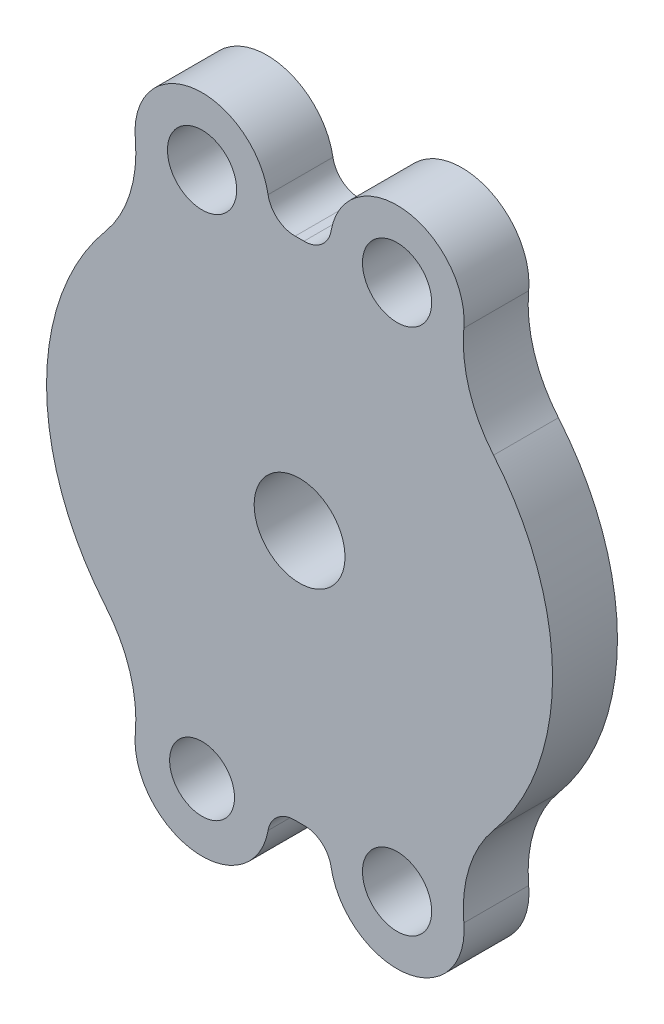
ISO-10303-21;
HEADER;
FILE_DESCRIPTION(('STEP AP214'),'2;1');
FILE_NAME('part.step','',(''),(''),'','','');
FILE_SCHEMA(('AUTOMOTIVE_DESIGN { 1 0 10303 214 1 1 1 1 }'));
ENDSEC;
DATA;
#1=APPLICATION_CONTEXT('core data for automotive mechanical design processes');
#2=APPLICATION_PROTOCOL_DEFINITION('international standard','automotive_design',2000,#1);
#3=PRODUCT_CONTEXT('',#1,'mechanical');
#4=PRODUCT('Part','Part','',(#3));
#5=PRODUCT_RELATED_PRODUCT_CATEGORY('part','',(#4));
#6=PRODUCT_DEFINITION_FORMATION('','',#4);
#7=PRODUCT_DEFINITION_CONTEXT('part definition',#1,'design');
#8=PRODUCT_DEFINITION('design','',#6,#7);
#9=PRODUCT_DEFINITION_SHAPE('','',#8);
#10=(LENGTH_UNIT() NAMED_UNIT(*) SI_UNIT(.MILLI.,.METRE.));
#11=(NAMED_UNIT(*) PLANE_ANGLE_UNIT() SI_UNIT($,.RADIAN.));
#12=(NAMED_UNIT(*) SI_UNIT($,.STERADIAN.) SOLID_ANGLE_UNIT());
#13=UNCERTAINTY_MEASURE_WITH_UNIT(LENGTH_MEASURE(1.E-05),#10,'distance_accuracy_value','');
#14=(GEOMETRIC_REPRESENTATION_CONTEXT(3) GLOBAL_UNCERTAINTY_ASSIGNED_CONTEXT((#13)) GLOBAL_UNIT_ASSIGNED_CONTEXT((#10,
#11,#12)) REPRESENTATION_CONTEXT('',''));
#15=CARTESIAN_POINT('',(0.,0.,0.));
#16=DIRECTION('',(0.,0.,1.));
#17=DIRECTION('',(1.,0.,0.));
#18=AXIS2_PLACEMENT_3D('',#15,#16,#17);
#19=CARTESIAN_POINT('',(-4.50880281690145,-12.1930593846788,-3.));
#20=DIRECTION('',(0.,0.,1.));
#21=DIRECTION('',(1.,0.,0.));
#22=AXIS2_PLACEMENT_3D('',#19,#20,#21);
#23=CYLINDRICAL_SURFACE('',#22,1.5);
#24=CARTESIAN_POINT('',(-4.50880281690145,-12.1930593846788,0.));
#25=DIRECTION('',(0.,0.,1.));
#26=DIRECTION('',(1.,0.,0.));
#27=AXIS2_PLACEMENT_3D('',#24,#25,#26);
#28=CIRCLE('',#27,1.5);
#29=CARTESIAN_POINT('',(-3.00880281690145,-12.1930593846788,0.));
#30=VERTEX_POINT('',#29);
#31=EDGE_CURVE('E395',#30,#30,#28,.T.);
#32=ORIENTED_EDGE('',*,*,#31,.T.);
#33=EDGE_LOOP('',(#32));
#34=FACE_BOUND('',#33,.T.);
#35=CARTESIAN_POINT('',(-4.50880281690145,-12.1930593846788,-3.));
#36=DIRECTION('',(0.,0.,1.));
#37=DIRECTION('',(1.,0.,0.));
#38=AXIS2_PLACEMENT_3D('',#35,#36,#37);
#39=CIRCLE('',#38,1.5);
#40=CARTESIAN_POINT('',(-3.00880281690145,-12.1930593846788,-3.));
#41=VERTEX_POINT('',#40);
#42=EDGE_CURVE('E240',#41,#41,#39,.T.);
#43=ORIENTED_EDGE('',*,*,#42,.F.);
#44=EDGE_LOOP('',(#43));
#45=FACE_BOUND('',#44,.T.);
#46=ADVANCED_FACE('F101',(#34,#45),#23,.F.);
#47=CARTESIAN_POINT('',(-4.50880281690145,-12.1930593846788,-3.));
#48=DIRECTION('',(0.,0.,1.));
#49=DIRECTION('',(1.,0.,0.));
#50=AXIS2_PLACEMENT_3D('',#47,#48,#49);
#51=CYLINDRICAL_SURFACE('',#50,3.1);
#52=CARTESIAN_POINT('',(-4.50880281690145,-12.1930593846788,-3.));
#53=DIRECTION('',(0.,0.,1.));
#54=DIRECTION('',(1.,0.,0.));
#55=AXIS2_PLACEMENT_3D('',#52,#53,#54);
#56=CIRCLE('',#55,3.1);
#57=CARTESIAN_POINT('',(-7.59588423001124,-11.9103433631447,-3.));
#58=VERTEX_POINT('',#57);
#59=CARTESIAN_POINT('',(-1.45585096363241,-12.7310974703392,-3.));
#60=VERTEX_POINT('',#59);
#61=EDGE_CURVE('E245',#58,#60,#56,.T.);
#62=ORIENTED_EDGE('',*,*,#61,.T.);
#63=DIRECTION('',(0.,0.,1.));
#64=VECTOR('',#63,1.);
#65=CARTESIAN_POINT('',(-1.45585096363241,-12.7310974703392,-3.));
#66=LINE('',#65,#64);
#67=CARTESIAN_POINT('',(-1.45585096363241,-12.7310974703392,0.));
#68=VERTEX_POINT('',#67);
#69=EDGE_CURVE('E362',#60,#68,#66,.T.);
#70=ORIENTED_EDGE('',*,*,#69,.T.);
#71=CARTESIAN_POINT('',(-4.50880281690145,-12.1930593846788,0.));
#72=DIRECTION('',(0.,0.,1.));
#73=DIRECTION('',(1.,0.,0.));
#74=AXIS2_PLACEMENT_3D('',#71,#72,#73);
#75=CIRCLE('',#74,3.1);
#76=CARTESIAN_POINT('',(-7.59588423001124,-11.9103433631447,0.));
#77=VERTEX_POINT('',#76);
#78=EDGE_CURVE('E392',#77,#68,#75,.T.);
#79=ORIENTED_EDGE('',*,*,#78,.F.);
#80=DIRECTION('',(0.,0.,1.));
#81=VECTOR('',#80,1.);
#82=CARTESIAN_POINT('',(-7.59588423001124,-11.9103433631447,-3.));
#83=LINE('',#82,#81);
#84=EDGE_CURVE('E255',#77,#58,#83,.F.);
#85=ORIENTED_EDGE('',*,*,#84,.T.);
#86=EDGE_LOOP('',(#62,#70,#79,#85));
#87=FACE_BOUND('',#86,.T.);
#88=ADVANCED_FACE('F391',(#87),#51,.T.);
#89=CARTESIAN_POINT('',(0.,0.,0.));
#90=DIRECTION('',(0.,0.,1.));
#91=DIRECTION('',(1.,0.,0.));
#92=AXIS2_PLACEMENT_3D('',#89,#90,#91);
#93=PLANE('',#92);
#94=CARTESIAN_POINT('',(0.,0.,0.));
#95=DIRECTION('',(0.,0.,1.));
#96=DIRECTION('',(1.,0.,0.));
#97=AXIS2_PLACEMENT_3D('',#94,#95,#96);
#98=CIRCLE('',#97,2.1);
#99=CARTESIAN_POINT('',(-2.1,0.,0.));
#100=VERTEX_POINT('',#99);
#101=EDGE_CURVE('E413',#100,#100,#98,.F.);
#102=ORIENTED_EDGE('',*,*,#101,.T.);
#103=EDGE_LOOP('',(#102));
#104=FACE_BOUND('',#103,.T.);
#105=ORIENTED_EDGE('',*,*,#31,.F.);
#106=EDGE_LOOP('',(#105));
#107=FACE_BOUND('',#106,.T.);
#108=CARTESIAN_POINT('',(4.50880281690123,-12.1930593846788,0.));
#109=DIRECTION('',(0.,0.,1.));
#110=DIRECTION('',(1.,0.,0.));
#111=AXIS2_PLACEMENT_3D('',#108,#109,#110);
#112=CIRCLE('',#111,1.6);
#113=CARTESIAN_POINT('',(6.10880281690124,-12.1930593846788,0.));
#114=VERTEX_POINT('',#113);
#115=EDGE_CURVE('E451',#114,#114,#112,.T.);
#116=ORIENTED_EDGE('',*,*,#115,.F.);
#117=EDGE_LOOP('',(#116));
#118=FACE_BOUND('',#117,.T.);
#119=CARTESIAN_POINT('',(4.50880281690123,12.1930593846787,0.));
#120=DIRECTION('',(0.,0.,1.));
#121=DIRECTION('',(1.,0.,0.));
#122=AXIS2_PLACEMENT_3D('',#119,#120,#121);
#123=CIRCLE('',#122,1.6);
#124=CARTESIAN_POINT('',(6.10880281690124,12.1930593846787,0.));
#125=VERTEX_POINT('',#124);
#126=EDGE_CURVE('E327',#125,#125,#123,.T.);
#127=ORIENTED_EDGE('',*,*,#126,.F.);
#128=EDGE_LOOP('',(#127));
#129=FACE_BOUND('',#128,.T.);
#130=CARTESIAN_POINT('',(-4.50880281690145,12.1930593846787,0.));
#131=DIRECTION('',(0.,0.,1.));
#132=DIRECTION('',(1.,0.,0.));
#133=AXIS2_PLACEMENT_3D('',#130,#131,#132);
#134=CIRCLE('',#133,1.6);
#135=CARTESIAN_POINT('',(-2.90880281690145,12.1930593846787,0.));
#136=VERTEX_POINT('',#135);
#137=EDGE_CURVE('E322',#136,#136,#134,.T.);
#138=ORIENTED_EDGE('',*,*,#137,.F.);
#139=EDGE_LOOP('',(#138));
#140=FACE_BOUND('',#139,.T.);
#141=CARTESIAN_POINT('',(0.,0.,0.));
#142=DIRECTION('',(0.,0.,1.));
#143=DIRECTION('',(1.,0.,0.));
#144=AXIS2_PLACEMENT_3D('',#141,#142,#143);
#145=CIRCLE('',#144,11.7);
#146=CARTESIAN_POINT('',(0.20312102620203,11.6982366982684,0.));
#147=VERTEX_POINT('',#146);
#148=CARTESIAN_POINT('',(-0.203121026202226,11.6982366982684,0.));
#149=VERTEX_POINT('',#148);
#150=EDGE_CURVE('E341',#147,#149,#145,.T.);
#151=ORIENTED_EDGE('',*,*,#150,.T.);
#152=CARTESIAN_POINT('',(-0.224821990540071,12.9480483113313,0.));
#153=DIRECTION('',(0.,0.,1.));
#154=DIRECTION('',(1.,0.,0.));
#155=AXIS2_PLACEMENT_3D('',#152,#153,#154);
#156=CIRCLE('',#155,1.25);
#157=CARTESIAN_POINT('',(-1.45585096363242,12.7310974703392,0.));
#158=VERTEX_POINT('',#157);
#159=EDGE_CURVE('E360',#149,#158,#156,.F.);
#160=ORIENTED_EDGE('',*,*,#159,.T.);
#161=CARTESIAN_POINT('',(-4.50880281690145,12.1930593846787,0.));
#162=DIRECTION('',(0.,0.,1.));
#163=DIRECTION('',(1.,0.,0.));
#164=AXIS2_PLACEMENT_3D('',#161,#162,#163);
#165=CIRCLE('',#164,3.1);
#166=CARTESIAN_POINT('',(-7.59588423001125,11.9103433631446,0.));
#167=VERTEX_POINT('',#166);
#168=EDGE_CURVE('E326',#158,#167,#165,.T.);
#169=ORIENTED_EDGE('',*,*,#168,.T.);
#170=CARTESIAN_POINT('',(-13.5708805134495,11.3631510634012,0.));
#171=DIRECTION('',(0.,0.,1.));
#172=DIRECTION('',(1.,0.,0.));
#173=AXIS2_PLACEMENT_3D('',#170,#171,#172);
#174=CIRCLE('',#173,6.);
#175=CARTESIAN_POINT('',(-8.97058203431411,7.51123544868892,0.));
#176=VERTEX_POINT('',#175);
#177=EDGE_CURVE('E440',#167,#176,#174,.F.);
#178=ORIENTED_EDGE('',*,*,#177,.T.);
#179=CARTESIAN_POINT('',(-8.9705820343141,-7.51123544868893,0.));
#180=VERTEX_POINT('',#179);
#181=EDGE_CURVE('E236',#176,#180,#145,.T.);
#182=ORIENTED_EDGE('',*,*,#181,.T.);
#183=CARTESIAN_POINT('',(-13.5708805134495,-11.3631510634012,0.));
#184=DIRECTION('',(0.,0.,1.));
#185=DIRECTION('',(1.,0.,0.));
#186=AXIS2_PLACEMENT_3D('',#183,#184,#185);
#187=CIRCLE('',#186,6.);
#188=EDGE_CURVE('E267',#180,#77,#187,.F.);
#189=ORIENTED_EDGE('',*,*,#188,.T.);
#190=ORIENTED_EDGE('',*,*,#78,.T.);
#191=CARTESIAN_POINT('',(-0.224821990540053,-12.9480483113313,0.));
#192=DIRECTION('',(0.,0.,1.));
#193=DIRECTION('',(1.,0.,0.));
#194=AXIS2_PLACEMENT_3D('',#191,#192,#193);
#195=CIRCLE('',#194,1.25);
#196=CARTESIAN_POINT('',(-0.20312102620221,-11.6982366982684,0.));
#197=VERTEX_POINT('',#196);
#198=EDGE_CURVE('E302',#68,#197,#195,.F.);
#199=ORIENTED_EDGE('',*,*,#198,.T.);
#200=CARTESIAN_POINT('',(0.203121026202009,-11.6982366982684,0.));
#201=VERTEX_POINT('',#200);
#202=EDGE_CURVE('E233',#197,#201,#145,.T.);
#203=ORIENTED_EDGE('',*,*,#202,.T.);
#204=CARTESIAN_POINT('',(0.224821990539831,-12.9480483113313,0.));
#205=DIRECTION('',(0.,0.,1.));
#206=DIRECTION('',(1.,0.,0.));
#207=AXIS2_PLACEMENT_3D('',#204,#205,#206);
#208=CIRCLE('',#207,1.25);
#209=CARTESIAN_POINT('',(1.45585096363219,-12.7310974703392,0.));
#210=VERTEX_POINT('',#209);
#211=EDGE_CURVE('E110',#201,#210,#208,.F.);
#212=ORIENTED_EDGE('',*,*,#211,.T.);
#213=CARTESIAN_POINT('',(4.50880281690123,-12.1930593846788,0.));
#214=DIRECTION('',(0.,0.,1.));
#215=DIRECTION('',(1.,0.,0.));
#216=AXIS2_PLACEMENT_3D('',#213,#214,#215);
#217=CIRCLE('',#216,3.1);
#218=CARTESIAN_POINT('',(7.59588423001103,-11.9103433631448,0.));
#219=VERTEX_POINT('',#218);
#220=EDGE_CURVE('E217',#210,#219,#217,.T.);
#221=ORIENTED_EDGE('',*,*,#220,.T.);
#222=CARTESIAN_POINT('',(13.5708805134493,-11.3631510634014,0.));
#223=DIRECTION('',(0.,0.,1.));
#224=DIRECTION('',(1.,0.,0.));
#225=AXIS2_PLACEMENT_3D('',#222,#223,#224);
#226=CIRCLE('',#225,6.);
#227=CARTESIAN_POINT('',(8.97058203431397,-7.51123544868908,0.));
#228=VERTEX_POINT('',#227);
#229=EDGE_CURVE('E212',#219,#228,#226,.F.);
#230=ORIENTED_EDGE('',*,*,#229,.T.);
#231=CARTESIAN_POINT('',(8.97058203431397,7.51123544868908,0.));
#232=VERTEX_POINT('',#231);
#233=EDGE_CURVE('E216',#228,#232,#145,.T.);
#234=ORIENTED_EDGE('',*,*,#233,.T.);
#235=CARTESIAN_POINT('',(13.5708805134493,11.3631510634014,0.));
#236=DIRECTION('',(0.,0.,1.));
#237=DIRECTION('',(1.,0.,0.));
#238=AXIS2_PLACEMENT_3D('',#235,#236,#237);
#239=CIRCLE('',#238,6.);
#240=CARTESIAN_POINT('',(7.59588423001103,11.9103433631447,0.));
#241=VERTEX_POINT('',#240);
#242=EDGE_CURVE('E262',#232,#241,#239,.F.);
#243=ORIENTED_EDGE('',*,*,#242,.T.);
#244=CARTESIAN_POINT('',(4.50880281690123,12.1930593846787,0.));
#245=DIRECTION('',(0.,0.,1.));
#246=DIRECTION('',(1.,0.,0.));
#247=AXIS2_PLACEMENT_3D('',#244,#245,#246);
#248=CIRCLE('',#247,3.1);
#249=CARTESIAN_POINT('',(1.4558509636322,12.7310974703392,0.));
#250=VERTEX_POINT('',#249);
#251=EDGE_CURVE('E284',#241,#250,#248,.T.);
#252=ORIENTED_EDGE('',*,*,#251,.T.);
#253=CARTESIAN_POINT('',(0.224821990539853,12.9480483113313,0.));
#254=DIRECTION('',(0.,0.,1.));
#255=DIRECTION('',(1.,0.,0.));
#256=AXIS2_PLACEMENT_3D('',#253,#254,#255);
#257=CIRCLE('',#256,1.25);
#258=EDGE_CURVE('E303',#250,#147,#257,.F.);
#259=ORIENTED_EDGE('',*,*,#258,.T.);
#260=EDGE_LOOP('',(#151,#160,#169,#178,#182,#189,#190,#199,#203,#212,#221,#230,#234,#243,#252,#259));
#261=FACE_BOUND('',#260,.T.);
#262=ADVANCED_FACE('F215',(#104,#107,#118,#129,#140,#261),#93,.T.);
#263=CARTESIAN_POINT('',(0.,0.,-3.));
#264=DIRECTION('',(0.,0.,1.));
#265=DIRECTION('',(1.,0.,0.));
#266=AXIS2_PLACEMENT_3D('',#263,#264,#265);
#267=PLANE('',#266);
#268=CARTESIAN_POINT('',(0.,0.,-3.));
#269=DIRECTION('',(0.,0.,-1.));
#270=DIRECTION('',(-1.,0.,0.));
#271=AXIS2_PLACEMENT_3D('',#268,#269,#270);
#272=CIRCLE('',#271,2.1);
#273=CARTESIAN_POINT('',(-2.1,0.,-3.));
#274=VERTEX_POINT('',#273);
#275=EDGE_CURVE('E234',#274,#274,#272,.T.);
#276=ORIENTED_EDGE('',*,*,#275,.F.);
#277=EDGE_LOOP('',(#276));
#278=FACE_BOUND('',#277,.T.);
#279=CARTESIAN_POINT('',(4.50880281690123,12.1930593846787,-3.));
#280=DIRECTION('',(0.,0.,1.));
#281=DIRECTION('',(1.,0.,0.));
#282=AXIS2_PLACEMENT_3D('',#279,#280,#281);
#283=CIRCLE('',#282,1.6);
#284=CARTESIAN_POINT('',(6.10880281690124,12.1930593846787,-3.));
#285=VERTEX_POINT('',#284);
#286=EDGE_CURVE('E317',#285,#285,#283,.T.);
#287=ORIENTED_EDGE('',*,*,#286,.T.);
#288=EDGE_LOOP('',(#287));
#289=FACE_BOUND('',#288,.T.);
#290=CARTESIAN_POINT('',(-4.50880281690145,12.1930593846787,-3.));
#291=DIRECTION('',(0.,0.,1.));
#292=DIRECTION('',(1.,0.,0.));
#293=AXIS2_PLACEMENT_3D('',#290,#291,#292);
#294=CIRCLE('',#293,1.6);
#295=CARTESIAN_POINT('',(-2.90880281690145,12.1930593846787,-3.));
#296=VERTEX_POINT('',#295);
#297=EDGE_CURVE('E432',#296,#296,#294,.T.);
#298=ORIENTED_EDGE('',*,*,#297,.T.);
#299=EDGE_LOOP('',(#298));
#300=FACE_BOUND('',#299,.T.);
#301=CARTESIAN_POINT('',(4.50880281690123,-12.1930593846788,-3.));
#302=DIRECTION('',(0.,0.,1.));
#303=DIRECTION('',(1.,0.,0.));
#304=AXIS2_PLACEMENT_3D('',#301,#302,#303);
#305=CIRCLE('',#304,1.6);
#306=CARTESIAN_POINT('',(6.10880281690124,-12.1930593846788,-3.));
#307=VERTEX_POINT('',#306);
#308=EDGE_CURVE('E400',#307,#307,#305,.T.);
#309=ORIENTED_EDGE('',*,*,#308,.T.);
#310=EDGE_LOOP('',(#309));
#311=FACE_BOUND('',#310,.T.);
#312=ORIENTED_EDGE('',*,*,#42,.T.);
#313=EDGE_LOOP('',(#312));
#314=FACE_BOUND('',#313,.T.);
#315=ORIENTED_EDGE('',*,*,#61,.F.);
#316=CARTESIAN_POINT('',(-13.5708805134495,-11.3631510634012,-3.));
#317=DIRECTION('',(0.,0.,1.));
#318=DIRECTION('',(1.,0.,0.));
#319=AXIS2_PLACEMENT_3D('',#316,#317,#318);
#320=CIRCLE('',#319,6.);
#321=CARTESIAN_POINT('',(-8.9705820343141,-7.51123544868893,-3.));
#322=VERTEX_POINT('',#321);
#323=EDGE_CURVE('E437',#58,#322,#320,.T.);
#324=ORIENTED_EDGE('',*,*,#323,.T.);
#325=CARTESIAN_POINT('',(0.,0.,-3.));
#326=DIRECTION('',(0.,0.,1.));
#327=DIRECTION('',(1.,0.,0.));
#328=AXIS2_PLACEMENT_3D('',#325,#326,#327);
#329=CIRCLE('',#328,11.7);
#330=CARTESIAN_POINT('',(-8.97058203431411,7.51123544868892,-3.));
#331=VERTEX_POINT('',#330);
#332=EDGE_CURVE('E281',#331,#322,#329,.T.);
#333=ORIENTED_EDGE('',*,*,#332,.F.);
#334=CARTESIAN_POINT('',(-13.5708805134495,11.3631510634012,-3.));
#335=DIRECTION('',(0.,0.,1.));
#336=DIRECTION('',(1.,0.,0.));
#337=AXIS2_PLACEMENT_3D('',#334,#335,#336);
#338=CIRCLE('',#337,6.);
#339=CARTESIAN_POINT('',(-7.59588423001125,11.9103433631446,-3.));
#340=VERTEX_POINT('',#339);
#341=EDGE_CURVE('E223',#331,#340,#338,.T.);
#342=ORIENTED_EDGE('',*,*,#341,.T.);
#343=CARTESIAN_POINT('',(-4.50880281690145,12.1930593846787,-3.));
#344=DIRECTION('',(0.,0.,1.));
#345=DIRECTION('',(1.,0.,0.));
#346=AXIS2_PLACEMENT_3D('',#343,#344,#345);
#347=CIRCLE('',#346,3.1);
#348=CARTESIAN_POINT('',(-1.45585096363242,12.7310974703392,-3.));
#349=VERTEX_POINT('',#348);
#350=EDGE_CURVE('E447',#349,#340,#347,.T.);
#351=ORIENTED_EDGE('',*,*,#350,.F.);
#352=CARTESIAN_POINT('',(-0.224821990540071,12.9480483113313,-3.));
#353=DIRECTION('',(0.,0.,1.));
#354=DIRECTION('',(1.,0.,0.));
#355=AXIS2_PLACEMENT_3D('',#352,#353,#354);
#356=CIRCLE('',#355,1.25);
#357=CARTESIAN_POINT('',(-0.203121026202226,11.6982366982684,-3.));
#358=VERTEX_POINT('',#357);
#359=EDGE_CURVE('E366',#349,#358,#356,.T.);
#360=ORIENTED_EDGE('',*,*,#359,.T.);
#361=CARTESIAN_POINT('',(0.20312102620203,11.6982366982684,-3.));
#362=VERTEX_POINT('',#361);
#363=EDGE_CURVE('E283',#362,#358,#329,.T.);
#364=ORIENTED_EDGE('',*,*,#363,.F.);
#365=CARTESIAN_POINT('',(0.224821990539853,12.9480483113313,-3.));
#366=DIRECTION('',(0.,0.,1.));
#367=DIRECTION('',(1.,0.,0.));
#368=AXIS2_PLACEMENT_3D('',#365,#366,#367);
#369=CIRCLE('',#368,1.25);
#370=CARTESIAN_POINT('',(1.4558509636322,12.7310974703392,-3.));
#371=VERTEX_POINT('',#370);
#372=EDGE_CURVE('E298',#362,#371,#369,.T.);
#373=ORIENTED_EDGE('',*,*,#372,.T.);
#374=CARTESIAN_POINT('',(4.50880281690123,12.1930593846787,-3.));
#375=DIRECTION('',(0.,0.,1.));
#376=DIRECTION('',(1.,0.,0.));
#377=AXIS2_PLACEMENT_3D('',#374,#375,#376);
#378=CIRCLE('',#377,3.1);
#379=CARTESIAN_POINT('',(7.59588423001103,11.9103433631447,-3.));
#380=VERTEX_POINT('',#379);
#381=EDGE_CURVE('E321',#380,#371,#378,.T.);
#382=ORIENTED_EDGE('',*,*,#381,.F.);
#383=CARTESIAN_POINT('',(13.5708805134493,11.3631510634014,-3.));
#384=DIRECTION('',(0.,0.,1.));
#385=DIRECTION('',(1.,0.,0.));
#386=AXIS2_PLACEMENT_3D('',#383,#384,#385);
#387=CIRCLE('',#386,6.);
#388=CARTESIAN_POINT('',(8.97058203431397,7.51123544868908,-3.));
#389=VERTEX_POINT('',#388);
#390=EDGE_CURVE('E264',#380,#389,#387,.T.);
#391=ORIENTED_EDGE('',*,*,#390,.T.);
#392=CARTESIAN_POINT('',(8.97058203431397,-7.51123544868908,-3.));
#393=VERTEX_POINT('',#392);
#394=EDGE_CURVE('E282',#393,#389,#329,.T.);
#395=ORIENTED_EDGE('',*,*,#394,.F.);
#396=CARTESIAN_POINT('',(13.5708805134493,-11.3631510634014,-3.));
#397=DIRECTION('',(0.,0.,1.));
#398=DIRECTION('',(1.,0.,0.));
#399=AXIS2_PLACEMENT_3D('',#396,#397,#398);
#400=CIRCLE('',#399,6.);
#401=CARTESIAN_POINT('',(7.59588423001103,-11.9103433631448,-3.));
#402=VERTEX_POINT('',#401);
#403=EDGE_CURVE('E222',#393,#402,#400,.T.);
#404=ORIENTED_EDGE('',*,*,#403,.T.);
#405=CARTESIAN_POINT('',(4.50880281690123,-12.1930593846788,-3.));
#406=DIRECTION('',(0.,0.,1.));
#407=DIRECTION('',(1.,0.,0.));
#408=AXIS2_PLACEMENT_3D('',#405,#406,#407);
#409=CIRCLE('',#408,3.1);
#410=CARTESIAN_POINT('',(1.45585096363219,-12.7310974703392,-3.));
#411=VERTEX_POINT('',#410);
#412=EDGE_CURVE('E396',#411,#402,#409,.T.);
#413=ORIENTED_EDGE('',*,*,#412,.F.);
#414=CARTESIAN_POINT('',(0.224821990539831,-12.9480483113313,-3.));
#415=DIRECTION('',(0.,0.,1.));
#416=DIRECTION('',(1.,0.,0.));
#417=AXIS2_PLACEMENT_3D('',#414,#415,#416);
#418=CIRCLE('',#417,1.25);
#419=CARTESIAN_POINT('',(0.203121026202009,-11.6982366982684,-3.));
#420=VERTEX_POINT('',#419);
#421=EDGE_CURVE('E13',#411,#420,#418,.T.);
#422=ORIENTED_EDGE('',*,*,#421,.T.);
#423=CARTESIAN_POINT('',(-0.20312102620221,-11.6982366982684,-3.));
#424=VERTEX_POINT('',#423);
#425=EDGE_CURVE('E277',#424,#420,#329,.T.);
#426=ORIENTED_EDGE('',*,*,#425,.F.);
#427=CARTESIAN_POINT('',(-0.224821990540053,-12.9480483113313,-3.));
#428=DIRECTION('',(0.,0.,1.));
#429=DIRECTION('',(1.,0.,0.));
#430=AXIS2_PLACEMENT_3D('',#427,#428,#429);
#431=CIRCLE('',#430,1.25);
#432=EDGE_CURVE('E305',#424,#60,#431,.T.);
#433=ORIENTED_EDGE('',*,*,#432,.T.);
#434=EDGE_LOOP('',(#315,#324,#333,#342,#351,#360,#364,#373,#382,#391,#395,#404,#413,#422,#426,#433));
#435=FACE_BOUND('',#434,.T.);
#436=ADVANCED_FACE('F421',(#278,#289,#300,#311,#314,#435),#267,.F.);
#437=CARTESIAN_POINT('',(4.50880281690123,-12.1930593846788,-3.));
#438=DIRECTION('',(0.,0.,1.));
#439=DIRECTION('',(1.,0.,0.));
#440=AXIS2_PLACEMENT_3D('',#437,#438,#439);
#441=CYLINDRICAL_SURFACE('',#440,1.6);
#442=ORIENTED_EDGE('',*,*,#115,.T.);
#443=EDGE_LOOP('',(#442));
#444=FACE_BOUND('',#443,.T.);
#445=ORIENTED_EDGE('',*,*,#308,.F.);
#446=EDGE_LOOP('',(#445));
#447=FACE_BOUND('',#446,.T.);
#448=ADVANCED_FACE('F424',(#444,#447),#441,.F.);
#449=CARTESIAN_POINT('',(-4.50880281690145,12.1930593846787,-3.));
#450=DIRECTION('',(0.,0.,1.));
#451=DIRECTION('',(1.,0.,0.));
#452=AXIS2_PLACEMENT_3D('',#449,#450,#451);
#453=CYLINDRICAL_SURFACE('',#452,1.6);
#454=ORIENTED_EDGE('',*,*,#137,.T.);
#455=EDGE_LOOP('',(#454));
#456=FACE_BOUND('',#455,.T.);
#457=ORIENTED_EDGE('',*,*,#297,.F.);
#458=EDGE_LOOP('',(#457));
#459=FACE_BOUND('',#458,.T.);
#460=ADVANCED_FACE('F457',(#456,#459),#453,.F.);
#461=CARTESIAN_POINT('',(4.50880281690123,12.1930593846787,-3.));
#462=DIRECTION('',(0.,0.,1.));
#463=DIRECTION('',(1.,0.,0.));
#464=AXIS2_PLACEMENT_3D('',#461,#462,#463);
#465=CYLINDRICAL_SURFACE('',#464,3.1);
#466=ORIENTED_EDGE('',*,*,#381,.T.);
#467=DIRECTION('',(0.,0.,1.));
#468=VECTOR('',#467,1.);
#469=CARTESIAN_POINT('',(1.4558509636322,12.7310974703392,-3.));
#470=LINE('',#469,#468);
#471=EDGE_CURVE('E387',#371,#250,#470,.T.);
#472=ORIENTED_EDGE('',*,*,#471,.T.);
#473=ORIENTED_EDGE('',*,*,#251,.F.);
#474=DIRECTION('',(0.,0.,1.));
#475=VECTOR('',#474,1.);
#476=CARTESIAN_POINT('',(7.59588423001103,11.9103433631447,-3.));
#477=LINE('',#476,#475);
#478=EDGE_CURVE('E242',#241,#380,#477,.F.);
#479=ORIENTED_EDGE('',*,*,#478,.T.);
#480=EDGE_LOOP('',(#466,#472,#473,#479));
#481=FACE_BOUND('',#480,.T.);
#482=ADVANCED_FACE('F476',(#481),#465,.T.);
#483=CARTESIAN_POINT('',(4.50880281690123,12.1930593846787,-3.));
#484=DIRECTION('',(0.,0.,1.));
#485=DIRECTION('',(1.,0.,0.));
#486=AXIS2_PLACEMENT_3D('',#483,#484,#485);
#487=CYLINDRICAL_SURFACE('',#486,1.6);
#488=ORIENTED_EDGE('',*,*,#126,.T.);
#489=EDGE_LOOP('',(#488));
#490=FACE_BOUND('',#489,.T.);
#491=ORIENTED_EDGE('',*,*,#286,.F.);
#492=EDGE_LOOP('',(#491));
#493=FACE_BOUND('',#492,.T.);
#494=ADVANCED_FACE('F489',(#490,#493),#487,.F.);
#495=CARTESIAN_POINT('',(-4.50880281690145,12.1930593846787,-3.));
#496=DIRECTION('',(0.,0.,1.));
#497=DIRECTION('',(1.,0.,0.));
#498=AXIS2_PLACEMENT_3D('',#495,#496,#497);
#499=CYLINDRICAL_SURFACE('',#498,3.1);
#500=ORIENTED_EDGE('',*,*,#168,.F.);
#501=DIRECTION('',(0.,0.,1.));
#502=VECTOR('',#501,1.);
#503=CARTESIAN_POINT('',(-1.45585096363242,12.7310974703392,-3.));
#504=LINE('',#503,#502);
#505=EDGE_CURVE('E382',#158,#349,#504,.F.);
#506=ORIENTED_EDGE('',*,*,#505,.T.);
#507=ORIENTED_EDGE('',*,*,#350,.T.);
#508=DIRECTION('',(0.,0.,1.));
#509=VECTOR('',#508,1.);
#510=CARTESIAN_POINT('',(-7.59588423001125,11.9103433631446,-3.));
#511=LINE('',#510,#509);
#512=EDGE_CURVE('E257',#340,#167,#511,.T.);
#513=ORIENTED_EDGE('',*,*,#512,.T.);
#514=EDGE_LOOP('',(#500,#506,#507,#513));
#515=FACE_BOUND('',#514,.T.);
#516=ADVANCED_FACE('F484',(#515),#499,.T.);
#517=CARTESIAN_POINT('',(4.50880281690123,-12.1930593846788,-3.));
#518=DIRECTION('',(0.,0.,1.));
#519=DIRECTION('',(1.,0.,0.));
#520=AXIS2_PLACEMENT_3D('',#517,#518,#519);
#521=CYLINDRICAL_SURFACE('',#520,3.1);
#522=ORIENTED_EDGE('',*,*,#220,.F.);
#523=DIRECTION('',(0.,0.,1.));
#524=VECTOR('',#523,1.);
#525=CARTESIAN_POINT('',(1.45585096363219,-12.7310974703392,-3.));
#526=LINE('',#525,#524);
#527=EDGE_CURVE('E123',#210,#411,#526,.F.);
#528=ORIENTED_EDGE('',*,*,#527,.T.);
#529=ORIENTED_EDGE('',*,*,#412,.T.);
#530=DIRECTION('',(0.,0.,1.));
#531=VECTOR('',#530,1.);
#532=CARTESIAN_POINT('',(7.59588423001103,-11.9103433631448,-3.));
#533=LINE('',#532,#531);
#534=EDGE_CURVE('E260',#402,#219,#533,.T.);
#535=ORIENTED_EDGE('',*,*,#534,.T.);
#536=EDGE_LOOP('',(#522,#528,#529,#535));
#537=FACE_BOUND('',#536,.T.);
#538=ADVANCED_FACE('F480',(#537),#521,.T.);
#539=CARTESIAN_POINT('',(0.,0.,-3.));
#540=DIRECTION('',(0.,0.,1.));
#541=DIRECTION('',(1.,0.,0.));
#542=AXIS2_PLACEMENT_3D('',#539,#540,#541);
#543=CYLINDRICAL_SURFACE('',#542,11.7);
#544=ORIENTED_EDGE('',*,*,#394,.T.);
#545=DIRECTION('',(0.,0.,1.));
#546=VECTOR('',#545,1.);
#547=CARTESIAN_POINT('',(8.97058203431397,7.51123544868908,-3.));
#548=LINE('',#547,#546);
#549=EDGE_CURVE('E232',#389,#232,#548,.T.);
#550=ORIENTED_EDGE('',*,*,#549,.T.);
#551=ORIENTED_EDGE('',*,*,#233,.F.);
#552=DIRECTION('',(0.,0.,1.));
#553=VECTOR('',#552,1.);
#554=CARTESIAN_POINT('',(8.97058203431397,-7.51123544868908,-3.));
#555=LINE('',#554,#553);
#556=EDGE_CURVE('E229',#228,#393,#555,.F.);
#557=ORIENTED_EDGE('',*,*,#556,.T.);
#558=EDGE_LOOP('',(#544,#550,#551,#557));
#559=FACE_BOUND('',#558,.T.);
#560=ADVANCED_FACE('F228',(#559),#543,.T.);
#561=ORIENTED_EDGE('',*,*,#202,.F.);
#562=DIRECTION('',(0.,0.,1.));
#563=VECTOR('',#562,1.);
#564=CARTESIAN_POINT('',(-0.20312102620221,-11.6982366982684,-3.));
#565=LINE('',#564,#563);
#566=EDGE_CURVE('E350',#197,#424,#565,.F.);
#567=ORIENTED_EDGE('',*,*,#566,.T.);
#568=ORIENTED_EDGE('',*,*,#425,.T.);
#569=DIRECTION('',(0.,0.,1.));
#570=VECTOR('',#569,1.);
#571=CARTESIAN_POINT('',(0.203121026202009,-11.6982366982684,-3.));
#572=LINE('',#571,#570);
#573=EDGE_CURVE('E353',#420,#201,#572,.T.);
#574=ORIENTED_EDGE('',*,*,#573,.T.);
#575=EDGE_LOOP('',(#561,#567,#568,#574));
#576=FACE_BOUND('',#575,.T.);
#577=ADVANCED_FACE('F349',(#576),#543,.T.);
#578=ORIENTED_EDGE('',*,*,#332,.T.);
#579=DIRECTION('',(0.,0.,1.));
#580=VECTOR('',#579,1.);
#581=CARTESIAN_POINT('',(-8.9705820343141,-7.51123544868892,-3.));
#582=LINE('',#581,#580);
#583=EDGE_CURVE('E252',#322,#180,#582,.T.);
#584=ORIENTED_EDGE('',*,*,#583,.T.);
#585=ORIENTED_EDGE('',*,*,#181,.F.);
#586=DIRECTION('',(0.,0.,1.));
#587=VECTOR('',#586,1.);
#588=CARTESIAN_POINT('',(-8.97058203431411,7.51123544868892,-3.));
#589=LINE('',#588,#587);
#590=EDGE_CURVE('E250',#176,#331,#589,.F.);
#591=ORIENTED_EDGE('',*,*,#590,.T.);
#592=EDGE_LOOP('',(#578,#584,#585,#591));
#593=FACE_BOUND('',#592,.T.);
#594=ADVANCED_FACE('F469',(#593),#543,.T.);
#595=ORIENTED_EDGE('',*,*,#363,.T.);
#596=DIRECTION('',(0.,0.,1.));
#597=VECTOR('',#596,1.);
#598=CARTESIAN_POINT('',(-0.203121026202226,11.6982366982684,-3.));
#599=LINE('',#598,#597);
#600=EDGE_CURVE('E378',#358,#149,#599,.T.);
#601=ORIENTED_EDGE('',*,*,#600,.T.);
#602=ORIENTED_EDGE('',*,*,#150,.F.);
#603=DIRECTION('',(0.,0.,1.));
#604=VECTOR('',#603,1.);
#605=CARTESIAN_POINT('',(0.20312102620203,11.6982366982684,-3.));
#606=LINE('',#605,#604);
#607=EDGE_CURVE('E377',#147,#362,#606,.F.);
#608=ORIENTED_EDGE('',*,*,#607,.T.);
#609=EDGE_LOOP('',(#595,#601,#602,#608));
#610=FACE_BOUND('',#609,.T.);
#611=ADVANCED_FACE('F376',(#610),#543,.T.);
#612=CARTESIAN_POINT('',(13.5708805134493,11.3631510634014,-3.));
#613=DIRECTION('',(0.,0.,-1.));
#614=DIRECTION('',(-1.,0.,0.));
#615=AXIS2_PLACEMENT_3D('',#612,#613,#614);
#616=CYLINDRICAL_SURFACE('',#615,6.);
#617=ORIENTED_EDGE('',*,*,#390,.F.);
#618=ORIENTED_EDGE('',*,*,#478,.F.);
#619=ORIENTED_EDGE('',*,*,#242,.F.);
#620=ORIENTED_EDGE('',*,*,#549,.F.);
#621=EDGE_LOOP('',(#617,#618,#619,#620));
#622=FACE_BOUND('',#621,.T.);
#623=ADVANCED_FACE('F426',(#622),#616,.F.);
#624=CARTESIAN_POINT('',(-13.5708805134495,-11.3631510634012,-3.));
#625=DIRECTION('',(0.,0.,-1.));
#626=DIRECTION('',(-1.,0.,0.));
#627=AXIS2_PLACEMENT_3D('',#624,#625,#626);
#628=CYLINDRICAL_SURFACE('',#627,6.);
#629=ORIENTED_EDGE('',*,*,#323,.F.);
#630=ORIENTED_EDGE('',*,*,#84,.F.);
#631=ORIENTED_EDGE('',*,*,#188,.F.);
#632=ORIENTED_EDGE('',*,*,#583,.F.);
#633=EDGE_LOOP('',(#629,#630,#631,#632));
#634=FACE_BOUND('',#633,.T.);
#635=ADVANCED_FACE('F439',(#634),#628,.F.);
#636=CARTESIAN_POINT('',(-13.5708805134495,11.3631510634012,-3.));
#637=DIRECTION('',(0.,0.,-1.));
#638=DIRECTION('',(-1.,0.,0.));
#639=AXIS2_PLACEMENT_3D('',#636,#637,#638);
#640=CYLINDRICAL_SURFACE('',#639,6.);
#641=ORIENTED_EDGE('',*,*,#341,.F.);
#642=ORIENTED_EDGE('',*,*,#590,.F.);
#643=ORIENTED_EDGE('',*,*,#177,.F.);
#644=ORIENTED_EDGE('',*,*,#512,.F.);
#645=EDGE_LOOP('',(#641,#642,#643,#644));
#646=FACE_BOUND('',#645,.T.);
#647=ADVANCED_FACE('F675',(#646),#640,.F.);
#648=CARTESIAN_POINT('',(13.5708805134493,-11.3631510634014,-3.));
#649=DIRECTION('',(0.,0.,-1.));
#650=DIRECTION('',(-1.,0.,0.));
#651=AXIS2_PLACEMENT_3D('',#648,#649,#650);
#652=CYLINDRICAL_SURFACE('',#651,6.);
#653=ORIENTED_EDGE('',*,*,#403,.F.);
#654=ORIENTED_EDGE('',*,*,#556,.F.);
#655=ORIENTED_EDGE('',*,*,#229,.F.);
#656=ORIENTED_EDGE('',*,*,#534,.F.);
#657=EDGE_LOOP('',(#653,#654,#655,#656));
#658=FACE_BOUND('',#657,.T.);
#659=ADVANCED_FACE('F238',(#658),#652,.F.);
#660=CARTESIAN_POINT('',(-0.224821990540071,12.9480483113313,-3.));
#661=DIRECTION('',(0.,0.,-1.));
#662=DIRECTION('',(-1.,0.,0.));
#663=AXIS2_PLACEMENT_3D('',#660,#661,#662);
#664=CYLINDRICAL_SURFACE('',#663,1.25);
#665=ORIENTED_EDGE('',*,*,#359,.F.);
#666=ORIENTED_EDGE('',*,*,#505,.F.);
#667=ORIENTED_EDGE('',*,*,#159,.F.);
#668=ORIENTED_EDGE('',*,*,#600,.F.);
#669=EDGE_LOOP('',(#665,#666,#667,#668));
#670=FACE_BOUND('',#669,.T.);
#671=ADVANCED_FACE('F565',(#670),#664,.F.);
#672=CARTESIAN_POINT('',(0.224821990539853,12.9480483113313,-3.));
#673=DIRECTION('',(0.,0.,-1.));
#674=DIRECTION('',(-1.,0.,0.));
#675=AXIS2_PLACEMENT_3D('',#672,#673,#674);
#676=CYLINDRICAL_SURFACE('',#675,1.25);
#677=ORIENTED_EDGE('',*,*,#372,.F.);
#678=ORIENTED_EDGE('',*,*,#607,.F.);
#679=ORIENTED_EDGE('',*,*,#258,.F.);
#680=ORIENTED_EDGE('',*,*,#471,.F.);
#681=EDGE_LOOP('',(#677,#678,#679,#680));
#682=FACE_BOUND('',#681,.T.);
#683=ADVANCED_FACE('F380',(#682),#676,.F.);
#684=CARTESIAN_POINT('',(-0.224821990540053,-12.9480483113313,-3.));
#685=DIRECTION('',(0.,0.,-1.));
#686=DIRECTION('',(-1.,0.,0.));
#687=AXIS2_PLACEMENT_3D('',#684,#685,#686);
#688=CYLINDRICAL_SURFACE('',#687,1.25);
#689=ORIENTED_EDGE('',*,*,#432,.F.);
#690=ORIENTED_EDGE('',*,*,#566,.F.);
#691=ORIENTED_EDGE('',*,*,#198,.F.);
#692=ORIENTED_EDGE('',*,*,#69,.F.);
#693=EDGE_LOOP('',(#689,#690,#691,#692));
#694=FACE_BOUND('',#693,.T.);
#695=ADVANCED_FACE('F356',(#694),#688,.F.);
#696=CARTESIAN_POINT('',(0.224821990539831,-12.9480483113313,-3.));
#697=DIRECTION('',(0.,0.,-1.));
#698=DIRECTION('',(-1.,0.,0.));
#699=AXIS2_PLACEMENT_3D('',#696,#697,#698);
#700=CYLINDRICAL_SURFACE('',#699,1.25);
#701=ORIENTED_EDGE('',*,*,#421,.F.);
#702=ORIENTED_EDGE('',*,*,#527,.F.);
#703=ORIENTED_EDGE('',*,*,#211,.F.);
#704=ORIENTED_EDGE('',*,*,#573,.F.);
#705=EDGE_LOOP('',(#701,#702,#703,#704));
#706=FACE_BOUND('',#705,.T.);
#707=ADVANCED_FACE('F103',(#706),#700,.F.);
#708=CARTESIAN_POINT('',(0.,0.,0.00100000000000013));
#709=DIRECTION('',(0.,0.,-1.));
#710=DIRECTION('',(-1.,0.,0.));
#711=AXIS2_PLACEMENT_3D('',#708,#709,#710);
#712=CYLINDRICAL_SURFACE('',#711,2.1);
#713=CARTESIAN_POINT('',(-2.1,0.,0.));
#714=CARTESIAN_POINT('',(-2.1,0.,-0.03125));
#715=CARTESIAN_POINT('',(-2.1,0.,-0.0625));
#716=CARTESIAN_POINT('',(-2.1,0.,-0.125));
#717=CARTESIAN_POINT('',(-2.1,0.,-0.15625));
#718=CARTESIAN_POINT('',(-2.1,0.,-0.21875));
#719=CARTESIAN_POINT('',(-2.1,0.,-0.25));
#720=CARTESIAN_POINT('',(-2.1,0.,-0.3125));
#721=CARTESIAN_POINT('',(-2.1,0.,-0.34375));
#722=CARTESIAN_POINT('',(-2.1,0.,-0.40625));
#723=CARTESIAN_POINT('',(-2.1,0.,-0.4375));
#724=CARTESIAN_POINT('',(-2.1,0.,-0.5));
#725=CARTESIAN_POINT('',(-2.1,0.,-0.53125));
#726=CARTESIAN_POINT('',(-2.1,0.,-0.59375));
#727=CARTESIAN_POINT('',(-2.1,0.,-0.625));
#728=CARTESIAN_POINT('',(-2.1,0.,-0.6875));
#729=CARTESIAN_POINT('',(-2.1,0.,-0.71875));
#730=CARTESIAN_POINT('',(-2.1,0.,-0.78125));
#731=CARTESIAN_POINT('',(-2.1,0.,-0.8125));
#732=CARTESIAN_POINT('',(-2.1,0.,-0.875));
#733=CARTESIAN_POINT('',(-2.1,0.,-0.90625));
#734=CARTESIAN_POINT('',(-2.1,0.,-0.96875));
#735=CARTESIAN_POINT('',(-2.1,0.,-1.));
#736=CARTESIAN_POINT('',(-2.1,0.,-1.0625));
#737=CARTESIAN_POINT('',(-2.1,0.,-1.09375));
#738=CARTESIAN_POINT('',(-2.1,0.,-1.15625));
#739=CARTESIAN_POINT('',(-2.1,0.,-1.1875));
#740=CARTESIAN_POINT('',(-2.1,0.,-1.25));
#741=CARTESIAN_POINT('',(-2.1,0.,-1.28125));
#742=CARTESIAN_POINT('',(-2.1,0.,-1.34375));
#743=CARTESIAN_POINT('',(-2.1,0.,-1.375));
#744=CARTESIAN_POINT('',(-2.1,0.,-1.4375));
#745=CARTESIAN_POINT('',(-2.1,0.,-1.46875));
#746=CARTESIAN_POINT('',(-2.1,0.,-1.53125));
#747=CARTESIAN_POINT('',(-2.1,0.,-1.5625));
#748=CARTESIAN_POINT('',(-2.1,0.,-1.625));
#749=CARTESIAN_POINT('',(-2.1,0.,-1.65625));
#750=CARTESIAN_POINT('',(-2.1,0.,-1.71875));
#751=CARTESIAN_POINT('',(-2.1,0.,-1.75));
#752=CARTESIAN_POINT('',(-2.1,0.,-1.8125));
#753=CARTESIAN_POINT('',(-2.1,0.,-1.84375));
#754=CARTESIAN_POINT('',(-2.1,0.,-1.90625));
#755=CARTESIAN_POINT('',(-2.1,0.,-1.9375));
#756=CARTESIAN_POINT('',(-2.1,0.,-2.));
#757=CARTESIAN_POINT('',(-2.1,0.,-2.03125));
#758=CARTESIAN_POINT('',(-2.1,0.,-2.09375));
#759=CARTESIAN_POINT('',(-2.1,0.,-2.125));
#760=CARTESIAN_POINT('',(-2.1,0.,-2.1875));
#761=CARTESIAN_POINT('',(-2.1,0.,-2.21875));
#762=CARTESIAN_POINT('',(-2.1,0.,-2.28125));
#763=CARTESIAN_POINT('',(-2.1,0.,-2.3125));
#764=CARTESIAN_POINT('',(-2.1,0.,-2.375));
#765=CARTESIAN_POINT('',(-2.1,0.,-2.40625));
#766=CARTESIAN_POINT('',(-2.1,0.,-2.46875));
#767=CARTESIAN_POINT('',(-2.1,0.,-2.5));
#768=CARTESIAN_POINT('',(-2.1,0.,-2.5625));
#769=CARTESIAN_POINT('',(-2.1,0.,-2.59375));
#770=CARTESIAN_POINT('',(-2.1,0.,-2.65625));
#771=CARTESIAN_POINT('',(-2.1,0.,-2.6875));
#772=CARTESIAN_POINT('',(-2.1,0.,-2.75));
#773=CARTESIAN_POINT('',(-2.1,0.,-2.78125));
#774=CARTESIAN_POINT('',(-2.1,0.,-2.84375));
#775=CARTESIAN_POINT('',(-2.1,0.,-2.875));
#776=CARTESIAN_POINT('',(-2.1,0.,-2.9375));
#777=CARTESIAN_POINT('',(-2.1,0.,-2.96875));
#778=CARTESIAN_POINT('',(-2.1,0.,-3.));
#779=B_SPLINE_CURVE_WITH_KNOTS('',3,(#713,#714,#715,#716,#717,#718,#719,#720,#721,#722,#723,
#724,#725,#726,#727,#728,#729,#730,#731,#732,#733,#734,#735,#736,#737,#738,#739,#740,#741,#742,
#743,#744,#745,#746,#747,#748,#749,#750,#751,#752,#753,#754,#755,#756,#757,#758,#759,#760,#761,
#762,#763,#764,#765,#766,#767,#768,#769,#770,#771,#772,#773,#774,#775,#776,#777,#778),
.UNSPECIFIED.,.F.,.F.,(4,2,2,2,2,2,2,2,2,2,2,2,2,2,2,2,2,2,2,2,2,2,2,2,2,2,2,2,2,2,2,2,4),(0.,
0.09375,0.1875,0.28125,0.375,0.46875,0.5625,0.65625,0.75,0.84375,0.9375,1.03125,1.125,1.21875,
1.3125,1.40625,1.5,1.59375,1.6875,1.78125,1.875,1.96875,2.0625,2.15625,2.25,2.34375,2.4375,
2.53125,2.625,2.71875,2.8125,2.90625,3.),.UNSPECIFIED.);
#780=EDGE_CURVE('BSEAM419',#100,#274,#779,.T.);
#781=ORIENTED_EDGE('',*,*,#101,.F.);
#782=ORIENTED_EDGE('',*,*,#275,.T.);
#783=ORIENTED_EDGE('',*,*,#780,.T.);
#784=ORIENTED_EDGE('',*,*,#780,.F.);
#785=EDGE_LOOP('',(#781,#783,#782,#784));
#786=FACE_BOUND('',#785,.T.);
#787=ADVANCED_FACE('F419',(#786),#712,.F.);
#788=CLOSED_SHELL('',(#46,#88,#262,#436,#448,#460,#482,#494,#516,#538,#560,#577,#594,#611,#623,
#635,#647,#659,#671,#683,#695,#707,#787));
#789=MANIFOLD_SOLID_BREP('B2',#788);
#790=ADVANCED_BREP_SHAPE_REPRESENTATION('',(#18,#789),#14);
#791=SHAPE_DEFINITION_REPRESENTATION(#9,#790);
ENDSEC;
END-ISO-10303-21;
